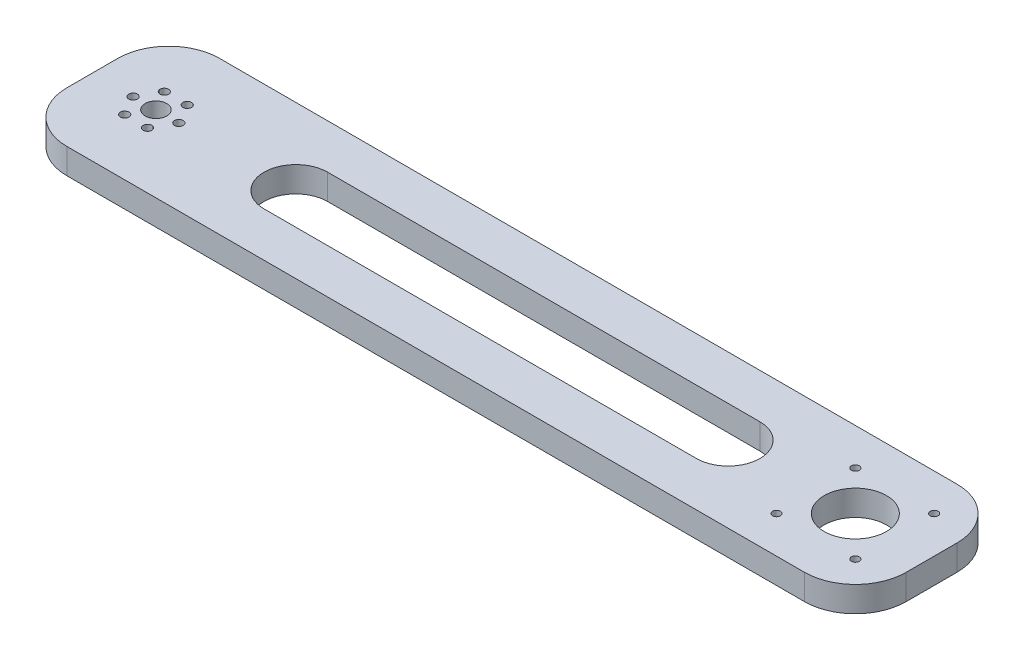
ISO-10303-21;
HEADER;
FILE_DESCRIPTION(('STEP AP214'),'2;1');
FILE_NAME('part.step','',(''),(''),'','','');
FILE_SCHEMA(('AUTOMOTIVE_DESIGN { 1 0 10303 214 1 1 1 1 }'));
ENDSEC;
DATA;
#1=APPLICATION_CONTEXT('core data for automotive mechanical design processes');
#2=APPLICATION_PROTOCOL_DEFINITION('international standard','automotive_design',2000,#1);
#3=PRODUCT_CONTEXT('',#1,'mechanical');
#4=PRODUCT('Part','Part','',(#3));
#5=PRODUCT_RELATED_PRODUCT_CATEGORY('part','',(#4));
#6=PRODUCT_DEFINITION_FORMATION('','',#4);
#7=PRODUCT_DEFINITION_CONTEXT('part definition',#1,'design');
#8=PRODUCT_DEFINITION('design','',#6,#7);
#9=PRODUCT_DEFINITION_SHAPE('','',#8);
#10=(LENGTH_UNIT() NAMED_UNIT(*) SI_UNIT(.MILLI.,.METRE.));
#11=(NAMED_UNIT(*) PLANE_ANGLE_UNIT() SI_UNIT($,.RADIAN.));
#12=(NAMED_UNIT(*) SI_UNIT($,.STERADIAN.) SOLID_ANGLE_UNIT());
#13=UNCERTAINTY_MEASURE_WITH_UNIT(LENGTH_MEASURE(1.E-05),#10,'distance_accuracy_value','');
#14=(GEOMETRIC_REPRESENTATION_CONTEXT(3) GLOBAL_UNCERTAINTY_ASSIGNED_CONTEXT((#13)) GLOBAL_UNIT_ASSIGNED_CONTEXT((#10,
#11,#12)) REPRESENTATION_CONTEXT('',''));
#15=CARTESIAN_POINT('',(0.,0.,0.));
#16=DIRECTION('',(0.,0.,1.));
#17=DIRECTION('',(1.,0.,0.));
#18=AXIS2_PLACEMENT_3D('',#15,#16,#17);
#19=CARTESIAN_POINT('',(165.,10.,30.));
#20=DIRECTION('',(-1.,0.,0.));
#21=DIRECTION('',(0.,0.,1.));
#22=AXIS2_PLACEMENT_3D('',#19,#20,#21);
#23=PLANE('',#22);
#24=DIRECTION('',(0.,0.,-1.));
#25=VECTOR('',#24,1.);
#26=CARTESIAN_POINT('',(165.,10.,30.));
#27=LINE('',#26,#25);
#28=CARTESIAN_POINT('',(165.,10.,9.99999999999999));
#29=VERTEX_POINT('',#28);
#30=CARTESIAN_POINT('',(165.,10.,-10.));
#31=VERTEX_POINT('',#30);
#32=EDGE_CURVE('E234',#29,#31,#27,.T.);
#33=ORIENTED_EDGE('',*,*,#32,.F.);
#34=DIRECTION('',(0.,-1.,0.));
#35=VECTOR('',#34,1.);
#36=CARTESIAN_POINT('',(165.,10.,9.99999999999999));
#37=LINE('',#36,#35);
#38=CARTESIAN_POINT('',(165.,0.,9.99999999999999));
#39=VERTEX_POINT('',#38);
#40=EDGE_CURVE('E269',#29,#39,#37,.T.);
#41=ORIENTED_EDGE('',*,*,#40,.T.);
#42=DIRECTION('',(0.,0.,-1.));
#43=VECTOR('',#42,1.);
#44=CARTESIAN_POINT('',(165.,0.,30.));
#45=LINE('',#44,#43);
#46=CARTESIAN_POINT('',(165.,0.,-10.));
#47=VERTEX_POINT('',#46);
#48=EDGE_CURVE('E255',#39,#47,#45,.T.);
#49=ORIENTED_EDGE('',*,*,#48,.T.);
#50=DIRECTION('',(0.,-1.,0.));
#51=VECTOR('',#50,1.);
#52=CARTESIAN_POINT('',(165.,10.,-10.));
#53=LINE('',#52,#51);
#54=EDGE_CURVE('E252',#47,#31,#53,.F.);
#55=ORIENTED_EDGE('',*,*,#54,.T.);
#56=EDGE_LOOP('',(#33,#41,#49,#55));
#57=FACE_BOUND('',#56,.T.);
#58=ADVANCED_FACE('F50',(#57),#23,.F.);
#59=CARTESIAN_POINT('',(-165.,10.,-30.));
#60=DIRECTION('',(0.,0.,1.));
#61=DIRECTION('',(1.,0.,0.));
#62=AXIS2_PLACEMENT_3D('',#59,#60,#61);
#63=PLANE('',#62);
#64=DIRECTION('',(-1.,0.,0.));
#65=VECTOR('',#64,1.);
#66=CARTESIAN_POINT('',(-165.,10.,-30.));
#67=LINE('',#66,#65);
#68=CARTESIAN_POINT('',(145.,10.,-30.));
#69=VERTEX_POINT('',#68);
#70=CARTESIAN_POINT('',(-145.,10.,-30.));
#71=VERTEX_POINT('',#70);
#72=EDGE_CURVE('E238',#69,#71,#67,.T.);
#73=ORIENTED_EDGE('',*,*,#72,.F.);
#74=DIRECTION('',(0.,-1.,0.));
#75=VECTOR('',#74,1.);
#76=CARTESIAN_POINT('',(145.,10.,-30.));
#77=LINE('',#76,#75);
#78=CARTESIAN_POINT('',(145.,0.,-30.));
#79=VERTEX_POINT('',#78);
#80=EDGE_CURVE('E310',#69,#79,#77,.T.);
#81=ORIENTED_EDGE('',*,*,#80,.T.);
#82=DIRECTION('',(-1.,0.,0.));
#83=VECTOR('',#82,1.);
#84=CARTESIAN_POINT('',(-165.,0.,-30.));
#85=LINE('',#84,#83);
#86=CARTESIAN_POINT('',(-145.,0.,-30.));
#87=VERTEX_POINT('',#86);
#88=EDGE_CURVE('E257',#79,#87,#85,.T.);
#89=ORIENTED_EDGE('',*,*,#88,.T.);
#90=DIRECTION('',(0.,-1.,0.));
#91=VECTOR('',#90,1.);
#92=CARTESIAN_POINT('',(-145.,10.,-30.));
#93=LINE('',#92,#91);
#94=EDGE_CURVE('E302',#87,#71,#93,.F.);
#95=ORIENTED_EDGE('',*,*,#94,.T.);
#96=EDGE_LOOP('',(#73,#81,#89,#95));
#97=FACE_BOUND('',#96,.T.);
#98=ADVANCED_FACE('F346',(#97),#63,.F.);
#99=CARTESIAN_POINT('',(-165.,10.,30.));
#100=DIRECTION('',(1.,0.,0.));
#101=DIRECTION('',(0.,0.,-1.));
#102=AXIS2_PLACEMENT_3D('',#99,#100,#101);
#103=PLANE('',#102);
#104=DIRECTION('',(0.,0.,1.));
#105=VECTOR('',#104,1.);
#106=CARTESIAN_POINT('',(-165.,10.,30.));
#107=LINE('',#106,#105);
#108=CARTESIAN_POINT('',(-165.,10.,-10.));
#109=VERTEX_POINT('',#108);
#110=CARTESIAN_POINT('',(-165.,10.,9.99999999999999));
#111=VERTEX_POINT('',#110);
#112=EDGE_CURVE('E243',#109,#111,#107,.T.);
#113=ORIENTED_EDGE('',*,*,#112,.F.);
#114=DIRECTION('',(0.,-1.,0.));
#115=VECTOR('',#114,1.);
#116=CARTESIAN_POINT('',(-165.,10.,-10.));
#117=LINE('',#116,#115);
#118=CARTESIAN_POINT('',(-165.,0.,-10.));
#119=VERTEX_POINT('',#118);
#120=EDGE_CURVE('E11',#109,#119,#117,.T.);
#121=ORIENTED_EDGE('',*,*,#120,.T.);
#122=DIRECTION('',(0.,0.,1.));
#123=VECTOR('',#122,1.);
#124=CARTESIAN_POINT('',(-165.,0.,30.));
#125=LINE('',#124,#123);
#126=CARTESIAN_POINT('',(-165.,0.,9.99999999999999));
#127=VERTEX_POINT('',#126);
#128=EDGE_CURVE('E256',#119,#127,#125,.T.);
#129=ORIENTED_EDGE('',*,*,#128,.T.);
#130=DIRECTION('',(0.,-1.,0.));
#131=VECTOR('',#130,1.);
#132=CARTESIAN_POINT('',(-165.,10.,9.99999999999999));
#133=LINE('',#132,#131);
#134=EDGE_CURVE('E60',#127,#111,#133,.F.);
#135=ORIENTED_EDGE('',*,*,#134,.T.);
#136=EDGE_LOOP('',(#113,#121,#129,#135));
#137=FACE_BOUND('',#136,.T.);
#138=ADVANCED_FACE('F317',(#137),#103,.F.);
#139=CARTESIAN_POINT('',(-165.,10.,30.));
#140=DIRECTION('',(0.,0.,-1.));
#141=DIRECTION('',(-1.,0.,0.));
#142=AXIS2_PLACEMENT_3D('',#139,#140,#141);
#143=PLANE('',#142);
#144=DIRECTION('',(1.,0.,0.));
#145=VECTOR('',#144,1.);
#146=CARTESIAN_POINT('',(-165.,0.,30.));
#147=LINE('',#146,#145);
#148=CARTESIAN_POINT('',(-145.,0.,30.));
#149=VERTEX_POINT('',#148);
#150=CARTESIAN_POINT('',(145.,0.,30.));
#151=VERTEX_POINT('',#150);
#152=EDGE_CURVE('E237',#149,#151,#147,.T.);
#153=ORIENTED_EDGE('',*,*,#152,.T.);
#154=DIRECTION('',(0.,-1.,0.));
#155=VECTOR('',#154,1.);
#156=CARTESIAN_POINT('',(145.,10.,30.));
#157=LINE('',#156,#155);
#158=CARTESIAN_POINT('',(145.,10.,30.));
#159=VERTEX_POINT('',#158);
#160=EDGE_CURVE('E289',#151,#159,#157,.F.);
#161=ORIENTED_EDGE('',*,*,#160,.T.);
#162=DIRECTION('',(1.,0.,0.));
#163=VECTOR('',#162,1.);
#164=CARTESIAN_POINT('',(-165.,10.,30.));
#165=LINE('',#164,#163);
#166=CARTESIAN_POINT('',(-145.,10.,30.));
#167=VERTEX_POINT('',#166);
#168=EDGE_CURVE('E250',#167,#159,#165,.T.);
#169=ORIENTED_EDGE('',*,*,#168,.F.);
#170=DIRECTION('',(0.,-1.,0.));
#171=VECTOR('',#170,1.);
#172=CARTESIAN_POINT('',(-145.,10.,30.));
#173=LINE('',#172,#171);
#174=EDGE_CURVE('E284',#167,#149,#173,.T.);
#175=ORIENTED_EDGE('',*,*,#174,.T.);
#176=EDGE_LOOP('',(#153,#161,#169,#175));
#177=FACE_BOUND('',#176,.T.);
#178=ADVANCED_FACE('F330',(#177),#143,.F.);
#179=CARTESIAN_POINT('',(0.,10.,0.));
#180=DIRECTION('',(0.,-1.,0.));
#181=DIRECTION('',(0.,0.,-1.));
#182=AXIS2_PLACEMENT_3D('',#179,#180,#181);
#183=PLANE('',#182);
#184=CARTESIAN_POINT('',(-144.5,10.,7.7942286340599));
#185=DIRECTION('',(0.,-1.,0.));
#186=DIRECTION('',(-0.866025403784433,0.,-0.50000000000001));
#187=AXIS2_PLACEMENT_3D('',#184,#185,#186);
#188=CIRCLE('',#187,1.70000000000001);
#189=CARTESIAN_POINT('',(-145.972243186434,10.,6.94422863405988));
#190=VERTEX_POINT('',#189);
#191=EDGE_CURVE('E647',#190,#190,#188,.T.);
#192=ORIENTED_EDGE('',*,*,#191,.T.);
#193=EDGE_LOOP('',(#192));
#194=FACE_BOUND('',#193,.T.);
#195=CARTESIAN_POINT('',(-135.5,10.,7.79422863405999));
#196=DIRECTION('',(0.,-1.,0.));
#197=DIRECTION('',(-0.866025403784443,0.,0.499999999999992));
#198=AXIS2_PLACEMENT_3D('',#195,#196,#197);
#199=CIRCLE('',#198,1.70000000000001);
#200=CARTESIAN_POINT('',(-136.972243186434,10.,8.64422863405998));
#201=VERTEX_POINT('',#200);
#202=EDGE_CURVE('E653',#201,#201,#199,.T.);
#203=ORIENTED_EDGE('',*,*,#202,.T.);
#204=EDGE_LOOP('',(#203));
#205=FACE_BOUND('',#204,.T.);
#206=CARTESIAN_POINT('',(-131.,10.,0.));
#207=DIRECTION('',(0.,-1.,0.));
#208=DIRECTION('',(0.,0.,1.));
#209=AXIS2_PLACEMENT_3D('',#206,#207,#208);
#210=CIRCLE('',#209,1.70000000000001);
#211=CARTESIAN_POINT('',(-131.,10.,1.70000000000001));
#212=VERTEX_POINT('',#211);
#213=EDGE_CURVE('E633',#212,#212,#210,.T.);
#214=ORIENTED_EDGE('',*,*,#213,.T.);
#215=EDGE_LOOP('',(#214));
#216=FACE_BOUND('',#215,.T.);
#217=CARTESIAN_POINT('',(-135.5,10.,-7.79422863405994));
#218=DIRECTION('',(0.,-1.,0.));
#219=DIRECTION('',(0.866025403784436,0.,0.500000000000004));
#220=AXIS2_PLACEMENT_3D('',#217,#218,#219);
#221=CIRCLE('',#220,1.70000000000001);
#222=CARTESIAN_POINT('',(-134.027756813566,10.,-6.94422863405993));
#223=VERTEX_POINT('',#222);
#224=EDGE_CURVE('E637',#223,#223,#221,.T.);
#225=ORIENTED_EDGE('',*,*,#224,.T.);
#226=EDGE_LOOP('',(#225));
#227=FACE_BOUND('',#226,.T.);
#228=CARTESIAN_POINT('',(-144.5,10.,-7.79422863405997));
#229=DIRECTION('',(0.,-1.,0.));
#230=DIRECTION('',(0.86602540378444,0.,-0.499999999999998));
#231=AXIS2_PLACEMENT_3D('',#228,#229,#230);
#232=CIRCLE('',#231,1.70000000000001);
#233=CARTESIAN_POINT('',(-143.027756813566,10.,-8.64422863405997));
#234=VERTEX_POINT('',#233);
#235=EDGE_CURVE('E644',#234,#234,#232,.T.);
#236=ORIENTED_EDGE('',*,*,#235,.T.);
#237=EDGE_LOOP('',(#236));
#238=FACE_BOUND('',#237,.T.);
#239=CARTESIAN_POINT('',(-149.,10.,0.));
#240=DIRECTION('',(0.,-1.,0.));
#241=DIRECTION('',(0.,0.,-1.));
#242=AXIS2_PLACEMENT_3D('',#239,#240,#241);
#243=CIRCLE('',#242,1.70000000000001);
#244=CARTESIAN_POINT('',(-149.,10.,-1.70000000000001));
#245=VERTEX_POINT('',#244);
#246=EDGE_CURVE('E176',#245,#245,#243,.T.);
#247=ORIENTED_EDGE('',*,*,#246,.T.);
#248=EDGE_LOOP('',(#247));
#249=FACE_BOUND('',#248,.T.);
#250=DIRECTION('',(-1.,0.,0.));
#251=VECTOR('',#250,1.);
#252=CARTESIAN_POINT('',(-85.,10.,12.5));
#253=LINE('',#252,#251);
#254=CARTESIAN_POINT('',(85.,10.,12.5));
#255=VERTEX_POINT('',#254);
#256=CARTESIAN_POINT('',(-85.,10.,12.5));
#257=VERTEX_POINT('',#256);
#258=EDGE_CURVE('E150',#255,#257,#253,.T.);
#259=ORIENTED_EDGE('',*,*,#258,.T.);
#260=CARTESIAN_POINT('',(-85.,10.,0.));
#261=DIRECTION('',(0.,-1.,0.));
#262=DIRECTION('',(0.,0.,-1.));
#263=AXIS2_PLACEMENT_3D('',#260,#261,#262);
#264=CIRCLE('',#263,12.5);
#265=CARTESIAN_POINT('',(-85.,10.,-12.5));
#266=VERTEX_POINT('',#265);
#267=EDGE_CURVE('E137',#257,#266,#264,.T.);
#268=ORIENTED_EDGE('',*,*,#267,.T.);
#269=DIRECTION('',(1.,0.,0.));
#270=VECTOR('',#269,1.);
#271=CARTESIAN_POINT('',(-85.,10.,-12.5));
#272=LINE('',#271,#270);
#273=CARTESIAN_POINT('',(85.,10.,-12.5));
#274=VERTEX_POINT('',#273);
#275=EDGE_CURVE('E146',#266,#274,#272,.T.);
#276=ORIENTED_EDGE('',*,*,#275,.T.);
#277=CARTESIAN_POINT('',(85.,10.,0.));
#278=DIRECTION('',(0.,-1.,0.));
#279=DIRECTION('',(0.,0.,-1.));
#280=AXIS2_PLACEMENT_3D('',#277,#278,#279);
#281=CIRCLE('',#280,12.5);
#282=EDGE_CURVE('E64',#274,#255,#281,.T.);
#283=ORIENTED_EDGE('',*,*,#282,.T.);
#284=EDGE_LOOP('',(#259,#268,#276,#283));
#285=FACE_BOUND('',#284,.T.);
#286=CARTESIAN_POINT('',(-140.,10.,0.));
#287=DIRECTION('',(0.,-1.,0.));
#288=DIRECTION('',(0.,0.,-1.));
#289=AXIS2_PLACEMENT_3D('',#286,#287,#288);
#290=CIRCLE('',#289,4.25000000000001);
#291=CARTESIAN_POINT('',(-140.,10.,-4.25000000000001));
#292=VERTEX_POINT('',#291);
#293=EDGE_CURVE('E192',#292,#292,#290,.T.);
#294=ORIENTED_EDGE('',*,*,#293,.T.);
#295=EDGE_LOOP('',(#294));
#296=FACE_BOUND('',#295,.T.);
#297=CARTESIAN_POINT('',(119.5,10.,-15.5));
#298=DIRECTION('',(0.,-1.,0.));
#299=DIRECTION('',(0.,0.,-1.));
#300=AXIS2_PLACEMENT_3D('',#297,#298,#299);
#301=CIRCLE('',#300,1.54999999999982);
#302=CARTESIAN_POINT('',(119.5,10.,-17.0499999999999));
#303=VERTEX_POINT('',#302);
#304=EDGE_CURVE('E191',#303,#303,#301,.T.);
#305=ORIENTED_EDGE('',*,*,#304,.T.);
#306=EDGE_LOOP('',(#305));
#307=FACE_BOUND('',#306,.T.);
#308=CARTESIAN_POINT('',(150.5,10.,-15.5));
#309=DIRECTION('',(0.,-1.,0.));
#310=DIRECTION('',(0.,0.,-1.));
#311=AXIS2_PLACEMENT_3D('',#308,#309,#310);
#312=CIRCLE('',#311,1.54999999999999);
#313=CARTESIAN_POINT('',(150.5,10.,-17.05));
#314=VERTEX_POINT('',#313);
#315=EDGE_CURVE('E215',#314,#314,#312,.T.);
#316=ORIENTED_EDGE('',*,*,#315,.T.);
#317=EDGE_LOOP('',(#316));
#318=FACE_BOUND('',#317,.T.);
#319=CARTESIAN_POINT('',(150.5,10.,15.5));
#320=DIRECTION('',(0.,-1.,0.));
#321=DIRECTION('',(0.,0.,-1.));
#322=AXIS2_PLACEMENT_3D('',#319,#320,#321);
#323=CIRCLE('',#322,1.54999999999999);
#324=CARTESIAN_POINT('',(150.5,10.,13.95));
#325=VERTEX_POINT('',#324);
#326=EDGE_CURVE('E204',#325,#325,#323,.T.);
#327=ORIENTED_EDGE('',*,*,#326,.T.);
#328=EDGE_LOOP('',(#327));
#329=FACE_BOUND('',#328,.T.);
#330=CARTESIAN_POINT('',(119.5,10.,15.5));
#331=DIRECTION('',(0.,-1.,0.));
#332=DIRECTION('',(0.,0.,-1.));
#333=AXIS2_PLACEMENT_3D('',#330,#331,#332);
#334=CIRCLE('',#333,1.54999999999976);
#335=CARTESIAN_POINT('',(119.5,10.,13.9500000000002));
#336=VERTEX_POINT('',#335);
#337=EDGE_CURVE('E221',#336,#336,#334,.T.);
#338=ORIENTED_EDGE('',*,*,#337,.T.);
#339=EDGE_LOOP('',(#338));
#340=FACE_BOUND('',#339,.T.);
#341=CARTESIAN_POINT('',(135.,10.,0.));
#342=DIRECTION('',(0.,1.,0.));
#343=DIRECTION('',(0.,0.,1.));
#344=AXIS2_PLACEMENT_3D('',#341,#342,#343);
#345=CIRCLE('',#344,12.25);
#346=CARTESIAN_POINT('',(135.,10.,12.25));
#347=VERTEX_POINT('',#346);
#348=EDGE_CURVE('E227',#347,#347,#345,.T.);
#349=ORIENTED_EDGE('',*,*,#348,.F.);
#350=EDGE_LOOP('',(#349));
#351=FACE_BOUND('',#350,.T.);
#352=ORIENTED_EDGE('',*,*,#168,.T.);
#353=CARTESIAN_POINT('',(145.,10.,9.99999999999999));
#354=DIRECTION('',(0.,-1.,0.));
#355=DIRECTION('',(0.,0.,-1.));
#356=AXIS2_PLACEMENT_3D('',#353,#354,#355);
#357=CIRCLE('',#356,20.);
#358=EDGE_CURVE('E301',#159,#29,#357,.F.);
#359=ORIENTED_EDGE('',*,*,#358,.T.);
#360=ORIENTED_EDGE('',*,*,#32,.T.);
#361=CARTESIAN_POINT('',(145.,10.,-10.));
#362=DIRECTION('',(0.,-1.,0.));
#363=DIRECTION('',(0.,0.,-1.));
#364=AXIS2_PLACEMENT_3D('',#361,#362,#363);
#365=CIRCLE('',#364,20.);
#366=EDGE_CURVE('E296',#31,#69,#365,.F.);
#367=ORIENTED_EDGE('',*,*,#366,.T.);
#368=ORIENTED_EDGE('',*,*,#72,.T.);
#369=CARTESIAN_POINT('',(-145.,10.,-10.));
#370=DIRECTION('',(0.,-1.,0.));
#371=DIRECTION('',(0.,0.,-1.));
#372=AXIS2_PLACEMENT_3D('',#369,#370,#371);
#373=CIRCLE('',#372,20.);
#374=EDGE_CURVE('E294',#71,#109,#373,.F.);
#375=ORIENTED_EDGE('',*,*,#374,.T.);
#376=ORIENTED_EDGE('',*,*,#112,.T.);
#377=CARTESIAN_POINT('',(-145.,10.,9.99999999999999));
#378=DIRECTION('',(0.,-1.,0.));
#379=DIRECTION('',(0.,0.,-1.));
#380=AXIS2_PLACEMENT_3D('',#377,#378,#379);
#381=CIRCLE('',#380,20.);
#382=EDGE_CURVE('E292',#111,#167,#381,.F.);
#383=ORIENTED_EDGE('',*,*,#382,.T.);
#384=EDGE_LOOP('',(#352,#359,#360,#367,#368,#375,#376,#383));
#385=FACE_BOUND('',#384,.T.);
#386=ADVANCED_FACE('F154',(#194,#205,#216,#227,#238,#249,#285,#296,#307,#318,#329,#340,#351,
#385),#183,.F.);
#387=CARTESIAN_POINT('',(0.,0.,0.));
#388=DIRECTION('',(0.,-1.,0.));
#389=DIRECTION('',(0.,0.,-1.));
#390=AXIS2_PLACEMENT_3D('',#387,#388,#389);
#391=PLANE('',#390);
#392=CARTESIAN_POINT('',(-144.5,0.,7.7942286340599));
#393=DIRECTION('',(0.,-1.,0.));
#394=DIRECTION('',(-0.866025403784433,0.,-0.50000000000001));
#395=AXIS2_PLACEMENT_3D('',#392,#393,#394);
#396=CIRCLE('',#395,1.70000000000001);
#397=CARTESIAN_POINT('',(-145.972243186434,0.,6.94422863405988));
#398=VERTEX_POINT('',#397);
#399=EDGE_CURVE('E649',#398,#398,#396,.T.);
#400=ORIENTED_EDGE('',*,*,#399,.F.);
#401=EDGE_LOOP('',(#400));
#402=FACE_BOUND('',#401,.T.);
#403=CARTESIAN_POINT('',(-135.5,0.,7.79422863405999));
#404=DIRECTION('',(0.,-1.,0.));
#405=DIRECTION('',(-0.866025403784443,0.,0.499999999999992));
#406=AXIS2_PLACEMENT_3D('',#403,#404,#405);
#407=CIRCLE('',#406,1.70000000000001);
#408=CARTESIAN_POINT('',(-136.972243186434,0.,8.64422863405998));
#409=VERTEX_POINT('',#408);
#410=EDGE_CURVE('E648',#409,#409,#407,.T.);
#411=ORIENTED_EDGE('',*,*,#410,.F.);
#412=EDGE_LOOP('',(#411));
#413=FACE_BOUND('',#412,.T.);
#414=CARTESIAN_POINT('',(-131.,0.,0.));
#415=DIRECTION('',(0.,-1.,0.));
#416=DIRECTION('',(0.,0.,1.));
#417=AXIS2_PLACEMENT_3D('',#414,#415,#416);
#418=CIRCLE('',#417,1.70000000000001);
#419=CARTESIAN_POINT('',(-131.,0.,1.70000000000001));
#420=VERTEX_POINT('',#419);
#421=EDGE_CURVE('E655',#420,#420,#418,.T.);
#422=ORIENTED_EDGE('',*,*,#421,.F.);
#423=EDGE_LOOP('',(#422));
#424=FACE_BOUND('',#423,.T.);
#425=CARTESIAN_POINT('',(-135.5,0.,-7.79422863405994));
#426=DIRECTION('',(0.,-1.,0.));
#427=DIRECTION('',(0.866025403784436,0.,0.500000000000004));
#428=AXIS2_PLACEMENT_3D('',#425,#426,#427);
#429=CIRCLE('',#428,1.70000000000001);
#430=CARTESIAN_POINT('',(-134.027756813566,0.,-6.94422863405993));
#431=VERTEX_POINT('',#430);
#432=EDGE_CURVE('E636',#431,#431,#429,.T.);
#433=ORIENTED_EDGE('',*,*,#432,.F.);
#434=EDGE_LOOP('',(#433));
#435=FACE_BOUND('',#434,.T.);
#436=CARTESIAN_POINT('',(-144.5,0.,-7.79422863405997));
#437=DIRECTION('',(0.,-1.,0.));
#438=DIRECTION('',(0.86602540378444,0.,-0.499999999999998));
#439=AXIS2_PLACEMENT_3D('',#436,#437,#438);
#440=CIRCLE('',#439,1.70000000000001);
#441=CARTESIAN_POINT('',(-143.027756813566,0.,-8.64422863405997));
#442=VERTEX_POINT('',#441);
#443=EDGE_CURVE('E642',#442,#442,#440,.T.);
#444=ORIENTED_EDGE('',*,*,#443,.F.);
#445=EDGE_LOOP('',(#444));
#446=FACE_BOUND('',#445,.T.);
#447=CARTESIAN_POINT('',(-149.,0.,0.));
#448=DIRECTION('',(0.,-1.,0.));
#449=DIRECTION('',(0.,0.,-1.));
#450=AXIS2_PLACEMENT_3D('',#447,#448,#449);
#451=CIRCLE('',#450,1.70000000000001);
#452=CARTESIAN_POINT('',(-149.,0.,-1.70000000000001));
#453=VERTEX_POINT('',#452);
#454=EDGE_CURVE('E170',#453,#453,#451,.T.);
#455=ORIENTED_EDGE('',*,*,#454,.F.);
#456=EDGE_LOOP('',(#455));
#457=FACE_BOUND('',#456,.T.);
#458=CARTESIAN_POINT('',(-85.,0.,0.));
#459=DIRECTION('',(0.,-1.,0.));
#460=DIRECTION('',(0.,0.,-1.));
#461=AXIS2_PLACEMENT_3D('',#458,#459,#460);
#462=CIRCLE('',#461,12.5);
#463=CARTESIAN_POINT('',(-85.,0.,12.5));
#464=VERTEX_POINT('',#463);
#465=CARTESIAN_POINT('',(-85.,0.,-12.5));
#466=VERTEX_POINT('',#465);
#467=EDGE_CURVE('E75',#464,#466,#462,.T.);
#468=ORIENTED_EDGE('',*,*,#467,.F.);
#469=DIRECTION('',(-1.,0.,0.));
#470=VECTOR('',#469,1.);
#471=CARTESIAN_POINT('',(-85.,0.,12.5));
#472=LINE('',#471,#470);
#473=CARTESIAN_POINT('',(85.,0.,12.5));
#474=VERTEX_POINT('',#473);
#475=EDGE_CURVE('E159',#474,#464,#472,.T.);
#476=ORIENTED_EDGE('',*,*,#475,.F.);
#477=CARTESIAN_POINT('',(85.,0.,0.));
#478=DIRECTION('',(0.,-1.,0.));
#479=DIRECTION('',(0.,0.,-1.));
#480=AXIS2_PLACEMENT_3D('',#477,#478,#479);
#481=CIRCLE('',#480,12.5);
#482=CARTESIAN_POINT('',(85.,0.,-12.5));
#483=VERTEX_POINT('',#482);
#484=EDGE_CURVE('E165',#483,#474,#481,.T.);
#485=ORIENTED_EDGE('',*,*,#484,.F.);
#486=DIRECTION('',(1.,0.,0.));
#487=VECTOR('',#486,1.);
#488=CARTESIAN_POINT('',(-85.,0.,-12.5));
#489=LINE('',#488,#487);
#490=EDGE_CURVE('E174',#466,#483,#489,.T.);
#491=ORIENTED_EDGE('',*,*,#490,.F.);
#492=EDGE_LOOP('',(#468,#476,#485,#491));
#493=FACE_BOUND('',#492,.T.);
#494=CARTESIAN_POINT('',(-140.,0.,0.));
#495=DIRECTION('',(0.,-1.,0.));
#496=DIRECTION('',(0.,0.,-1.));
#497=AXIS2_PLACEMENT_3D('',#494,#495,#496);
#498=CIRCLE('',#497,4.25000000000001);
#499=CARTESIAN_POINT('',(-140.,0.,-4.25000000000001));
#500=VERTEX_POINT('',#499);
#501=EDGE_CURVE('E184',#500,#500,#498,.T.);
#502=ORIENTED_EDGE('',*,*,#501,.F.);
#503=EDGE_LOOP('',(#502));
#504=FACE_BOUND('',#503,.T.);
#505=CARTESIAN_POINT('',(119.5,0.,-15.5));
#506=DIRECTION('',(0.,-1.,0.));
#507=DIRECTION('',(0.,0.,-1.));
#508=AXIS2_PLACEMENT_3D('',#505,#506,#507);
#509=CIRCLE('',#508,1.54999999999982);
#510=CARTESIAN_POINT('',(119.5,0.,-17.0499999999999));
#511=VERTEX_POINT('',#510);
#512=EDGE_CURVE('E216',#511,#511,#509,.T.);
#513=ORIENTED_EDGE('',*,*,#512,.F.);
#514=EDGE_LOOP('',(#513));
#515=FACE_BOUND('',#514,.T.);
#516=CARTESIAN_POINT('',(150.5,0.,-15.5));
#517=DIRECTION('',(0.,-1.,0.));
#518=DIRECTION('',(0.,0.,-1.));
#519=AXIS2_PLACEMENT_3D('',#516,#517,#518);
#520=CIRCLE('',#519,1.54999999999999);
#521=CARTESIAN_POINT('',(150.5,0.,-17.05));
#522=VERTEX_POINT('',#521);
#523=EDGE_CURVE('E206',#522,#522,#520,.T.);
#524=ORIENTED_EDGE('',*,*,#523,.F.);
#525=EDGE_LOOP('',(#524));
#526=FACE_BOUND('',#525,.T.);
#527=CARTESIAN_POINT('',(150.5,0.,15.5));
#528=DIRECTION('',(0.,-1.,0.));
#529=DIRECTION('',(0.,0.,-1.));
#530=AXIS2_PLACEMENT_3D('',#527,#528,#529);
#531=CIRCLE('',#530,1.54999999999999);
#532=CARTESIAN_POINT('',(150.5,0.,13.95));
#533=VERTEX_POINT('',#532);
#534=EDGE_CURVE('E198',#533,#533,#531,.T.);
#535=ORIENTED_EDGE('',*,*,#534,.F.);
#536=EDGE_LOOP('',(#535));
#537=FACE_BOUND('',#536,.T.);
#538=CARTESIAN_POINT('',(119.5,0.,15.5));
#539=DIRECTION('',(0.,-1.,0.));
#540=DIRECTION('',(0.,0.,-1.));
#541=AXIS2_PLACEMENT_3D('',#538,#539,#540);
#542=CIRCLE('',#541,1.54999999999976);
#543=CARTESIAN_POINT('',(119.5,0.,13.9500000000002));
#544=VERTEX_POINT('',#543);
#545=EDGE_CURVE('E201',#544,#544,#542,.T.);
#546=ORIENTED_EDGE('',*,*,#545,.F.);
#547=EDGE_LOOP('',(#546));
#548=FACE_BOUND('',#547,.T.);
#549=CARTESIAN_POINT('',(135.,0.,0.));
#550=DIRECTION('',(0.,-1.,0.));
#551=DIRECTION('',(0.,0.,-1.));
#552=AXIS2_PLACEMENT_3D('',#549,#550,#551);
#553=CIRCLE('',#552,12.25);
#554=CARTESIAN_POINT('',(135.,0.,-12.25));
#555=VERTEX_POINT('',#554);
#556=EDGE_CURVE('E51',#555,#555,#553,.T.);
#557=ORIENTED_EDGE('',*,*,#556,.F.);
#558=EDGE_LOOP('',(#557));
#559=FACE_BOUND('',#558,.T.);
#560=ORIENTED_EDGE('',*,*,#48,.F.);
#561=CARTESIAN_POINT('',(145.,0.,9.99999999999999));
#562=DIRECTION('',(0.,-1.,0.));
#563=DIRECTION('',(0.,0.,-1.));
#564=AXIS2_PLACEMENT_3D('',#561,#562,#563);
#565=CIRCLE('',#564,20.);
#566=EDGE_CURVE('E285',#39,#151,#565,.T.);
#567=ORIENTED_EDGE('',*,*,#566,.T.);
#568=ORIENTED_EDGE('',*,*,#152,.F.);
#569=CARTESIAN_POINT('',(-145.,0.,9.99999999999999));
#570=DIRECTION('',(0.,-1.,0.));
#571=DIRECTION('',(0.,0.,-1.));
#572=AXIS2_PLACEMENT_3D('',#569,#570,#571);
#573=CIRCLE('',#572,20.);
#574=EDGE_CURVE('E271',#149,#127,#573,.T.);
#575=ORIENTED_EDGE('',*,*,#574,.T.);
#576=ORIENTED_EDGE('',*,*,#128,.F.);
#577=CARTESIAN_POINT('',(-145.,0.,-10.));
#578=DIRECTION('',(0.,-1.,0.));
#579=DIRECTION('',(0.,0.,-1.));
#580=AXIS2_PLACEMENT_3D('',#577,#578,#579);
#581=CIRCLE('',#580,20.);
#582=EDGE_CURVE('E277',#119,#87,#581,.T.);
#583=ORIENTED_EDGE('',*,*,#582,.T.);
#584=ORIENTED_EDGE('',*,*,#88,.F.);
#585=CARTESIAN_POINT('',(145.,0.,-10.));
#586=DIRECTION('',(0.,-1.,0.));
#587=DIRECTION('',(0.,0.,-1.));
#588=AXIS2_PLACEMENT_3D('',#585,#586,#587);
#589=CIRCLE('',#588,20.);
#590=EDGE_CURVE('E279',#79,#47,#589,.T.);
#591=ORIENTED_EDGE('',*,*,#590,.T.);
#592=EDGE_LOOP('',(#560,#567,#568,#575,#576,#583,#584,#591));
#593=FACE_BOUND('',#592,.T.);
#594=ADVANCED_FACE('F333',(#402,#413,#424,#435,#446,#457,#493,#504,#515,#526,#537,#548,#559,
#593),#391,.T.);
#595=CARTESIAN_POINT('',(145.,10.,9.99999999999999));
#596=DIRECTION('',(0.,-1.,0.));
#597=DIRECTION('',(0.,0.,-1.));
#598=AXIS2_PLACEMENT_3D('',#595,#596,#597);
#599=CYLINDRICAL_SURFACE('',#598,20.);
#600=ORIENTED_EDGE('',*,*,#358,.F.);
#601=ORIENTED_EDGE('',*,*,#160,.F.);
#602=ORIENTED_EDGE('',*,*,#566,.F.);
#603=ORIENTED_EDGE('',*,*,#40,.F.);
#604=EDGE_LOOP('',(#600,#601,#602,#603));
#605=FACE_BOUND('',#604,.T.);
#606=ADVANCED_FACE('F332',(#605),#599,.T.);
#607=CARTESIAN_POINT('',(145.,10.,-10.));
#608=DIRECTION('',(0.,-1.,0.));
#609=DIRECTION('',(0.,0.,-1.));
#610=AXIS2_PLACEMENT_3D('',#607,#608,#609);
#611=CYLINDRICAL_SURFACE('',#610,20.);
#612=ORIENTED_EDGE('',*,*,#366,.F.);
#613=ORIENTED_EDGE('',*,*,#54,.F.);
#614=ORIENTED_EDGE('',*,*,#590,.F.);
#615=ORIENTED_EDGE('',*,*,#80,.F.);
#616=EDGE_LOOP('',(#612,#613,#614,#615));
#617=FACE_BOUND('',#616,.T.);
#618=ADVANCED_FACE('F343',(#617),#611,.T.);
#619=CARTESIAN_POINT('',(-145.,10.,-10.));
#620=DIRECTION('',(0.,-1.,0.));
#621=DIRECTION('',(0.,0.,-1.));
#622=AXIS2_PLACEMENT_3D('',#619,#620,#621);
#623=CYLINDRICAL_SURFACE('',#622,20.);
#624=ORIENTED_EDGE('',*,*,#374,.F.);
#625=ORIENTED_EDGE('',*,*,#94,.F.);
#626=ORIENTED_EDGE('',*,*,#582,.F.);
#627=ORIENTED_EDGE('',*,*,#120,.F.);
#628=EDGE_LOOP('',(#624,#625,#626,#627));
#629=FACE_BOUND('',#628,.T.);
#630=ADVANCED_FACE('F348',(#629),#623,.T.);
#631=CARTESIAN_POINT('',(-145.,10.,9.99999999999999));
#632=DIRECTION('',(0.,-1.,0.));
#633=DIRECTION('',(0.,0.,-1.));
#634=AXIS2_PLACEMENT_3D('',#631,#632,#633);
#635=CYLINDRICAL_SURFACE('',#634,20.);
#636=ORIENTED_EDGE('',*,*,#382,.F.);
#637=ORIENTED_EDGE('',*,*,#134,.F.);
#638=ORIENTED_EDGE('',*,*,#574,.F.);
#639=ORIENTED_EDGE('',*,*,#174,.F.);
#640=EDGE_LOOP('',(#636,#637,#638,#639));
#641=FACE_BOUND('',#640,.T.);
#642=ADVANCED_FACE('F47',(#641),#635,.T.);
#643=CARTESIAN_POINT('',(135.,-2.,0.));
#644=DIRECTION('',(0.,1.,0.));
#645=DIRECTION('',(0.,0.,1.));
#646=AXIS2_PLACEMENT_3D('',#643,#644,#645);
#647=CYLINDRICAL_SURFACE('',#646,12.25);
#648=ORIENTED_EDGE('',*,*,#556,.T.);
#649=EDGE_LOOP('',(#648));
#650=FACE_BOUND('',#649,.T.);
#651=ORIENTED_EDGE('',*,*,#348,.T.);
#652=EDGE_LOOP('',(#651));
#653=FACE_BOUND('',#652,.T.);
#654=ADVANCED_FACE('F354',(#650,#653),#647,.F.);
#655=CARTESIAN_POINT('',(119.5,10.,15.5));
#656=DIRECTION('',(0.,-1.,0.));
#657=DIRECTION('',(0.,0.,-1.));
#658=AXIS2_PLACEMENT_3D('',#655,#656,#657);
#659=CYLINDRICAL_SURFACE('',#658,1.54999999999976);
#660=ORIENTED_EDGE('',*,*,#337,.F.);
#661=EDGE_LOOP('',(#660));
#662=FACE_BOUND('',#661,.T.);
#663=ORIENTED_EDGE('',*,*,#545,.T.);
#664=EDGE_LOOP('',(#663));
#665=FACE_BOUND('',#664,.T.);
#666=ADVANCED_FACE('F511',(#662,#665),#659,.F.);
#667=CARTESIAN_POINT('',(150.5,10.,15.5));
#668=DIRECTION('',(0.,-1.,0.));
#669=DIRECTION('',(0.,0.,-1.));
#670=AXIS2_PLACEMENT_3D('',#667,#668,#669);
#671=CYLINDRICAL_SURFACE('',#670,1.54999999999999);
#672=ORIENTED_EDGE('',*,*,#326,.F.);
#673=EDGE_LOOP('',(#672));
#674=FACE_BOUND('',#673,.T.);
#675=ORIENTED_EDGE('',*,*,#534,.T.);
#676=EDGE_LOOP('',(#675));
#677=FACE_BOUND('',#676,.T.);
#678=ADVANCED_FACE('F510',(#674,#677),#671,.F.);
#679=CARTESIAN_POINT('',(150.5,10.,-15.5));
#680=DIRECTION('',(0.,-1.,0.));
#681=DIRECTION('',(0.,0.,-1.));
#682=AXIS2_PLACEMENT_3D('',#679,#680,#681);
#683=CYLINDRICAL_SURFACE('',#682,1.54999999999999);
#684=ORIENTED_EDGE('',*,*,#315,.F.);
#685=EDGE_LOOP('',(#684));
#686=FACE_BOUND('',#685,.T.);
#687=ORIENTED_EDGE('',*,*,#523,.T.);
#688=EDGE_LOOP('',(#687));
#689=FACE_BOUND('',#688,.T.);
#690=ADVANCED_FACE('F499',(#686,#689),#683,.F.);
#691=CARTESIAN_POINT('',(119.5,10.,-15.5));
#692=DIRECTION('',(0.,-1.,0.));
#693=DIRECTION('',(0.,0.,-1.));
#694=AXIS2_PLACEMENT_3D('',#691,#692,#693);
#695=CYLINDRICAL_SURFACE('',#694,1.54999999999982);
#696=ORIENTED_EDGE('',*,*,#304,.F.);
#697=EDGE_LOOP('',(#696));
#698=FACE_BOUND('',#697,.T.);
#699=ORIENTED_EDGE('',*,*,#512,.T.);
#700=EDGE_LOOP('',(#699));
#701=FACE_BOUND('',#700,.T.);
#702=ADVANCED_FACE('F491',(#698,#701),#695,.F.);
#703=CARTESIAN_POINT('',(-140.,10.,0.));
#704=DIRECTION('',(0.,-1.,0.));
#705=DIRECTION('',(0.,0.,-1.));
#706=AXIS2_PLACEMENT_3D('',#703,#704,#705);
#707=CYLINDRICAL_SURFACE('',#706,4.25000000000001);
#708=ORIENTED_EDGE('',*,*,#293,.F.);
#709=EDGE_LOOP('',(#708));
#710=FACE_BOUND('',#709,.T.);
#711=ORIENTED_EDGE('',*,*,#501,.T.);
#712=EDGE_LOOP('',(#711));
#713=FACE_BOUND('',#712,.T.);
#714=ADVANCED_FACE('F487',(#710,#713),#707,.F.);
#715=CARTESIAN_POINT('',(-85.,10.,0.));
#716=DIRECTION('',(0.,-1.,0.));
#717=DIRECTION('',(0.,0.,-1.));
#718=AXIS2_PLACEMENT_3D('',#715,#716,#717);
#719=CYLINDRICAL_SURFACE('',#718,12.5);
#720=ORIENTED_EDGE('',*,*,#467,.T.);
#721=DIRECTION('',(0.,-1.,0.));
#722=VECTOR('',#721,1.);
#723=CARTESIAN_POINT('',(-85.,10.,-12.5));
#724=LINE('',#723,#722);
#725=EDGE_CURVE('E138',#266,#466,#724,.T.);
#726=ORIENTED_EDGE('',*,*,#725,.F.);
#727=ORIENTED_EDGE('',*,*,#267,.F.);
#728=DIRECTION('',(0.,-1.,0.));
#729=VECTOR('',#728,1.);
#730=CARTESIAN_POINT('',(-85.,10.,12.5));
#731=LINE('',#730,#729);
#732=EDGE_CURVE('E185',#257,#464,#731,.T.);
#733=ORIENTED_EDGE('',*,*,#732,.T.);
#734=EDGE_LOOP('',(#720,#726,#727,#733));
#735=FACE_BOUND('',#734,.T.);
#736=ADVANCED_FACE('F136',(#735),#719,.F.);
#737=CARTESIAN_POINT('',(-85.,10.,12.5));
#738=DIRECTION('',(0.,0.,1.));
#739=DIRECTION('',(1.,0.,0.));
#740=AXIS2_PLACEMENT_3D('',#737,#738,#739);
#741=PLANE('',#740);
#742=ORIENTED_EDGE('',*,*,#475,.T.);
#743=ORIENTED_EDGE('',*,*,#732,.F.);
#744=ORIENTED_EDGE('',*,*,#258,.F.);
#745=DIRECTION('',(0.,-1.,0.));
#746=VECTOR('',#745,1.);
#747=CARTESIAN_POINT('',(85.,10.,12.5));
#748=LINE('',#747,#746);
#749=EDGE_CURVE('E187',#255,#474,#748,.T.);
#750=ORIENTED_EDGE('',*,*,#749,.T.);
#751=EDGE_LOOP('',(#742,#743,#744,#750));
#752=FACE_BOUND('',#751,.T.);
#753=ADVANCED_FACE('F471',(#752),#741,.F.);
#754=CARTESIAN_POINT('',(85.,10.,0.));
#755=DIRECTION('',(0.,-1.,0.));
#756=DIRECTION('',(0.,0.,-1.));
#757=AXIS2_PLACEMENT_3D('',#754,#755,#756);
#758=CYLINDRICAL_SURFACE('',#757,12.5);
#759=ORIENTED_EDGE('',*,*,#484,.T.);
#760=ORIENTED_EDGE('',*,*,#749,.F.);
#761=ORIENTED_EDGE('',*,*,#282,.F.);
#762=DIRECTION('',(0.,-1.,0.));
#763=VECTOR('',#762,1.);
#764=CARTESIAN_POINT('',(85.,10.,-12.5));
#765=LINE('',#764,#763);
#766=EDGE_CURVE('E147',#274,#483,#765,.T.);
#767=ORIENTED_EDGE('',*,*,#766,.T.);
#768=EDGE_LOOP('',(#759,#760,#761,#767));
#769=FACE_BOUND('',#768,.T.);
#770=ADVANCED_FACE('F469',(#769),#758,.F.);
#771=CARTESIAN_POINT('',(-85.,10.,-12.5));
#772=DIRECTION('',(0.,0.,-1.));
#773=DIRECTION('',(-1.,0.,0.));
#774=AXIS2_PLACEMENT_3D('',#771,#772,#773);
#775=PLANE('',#774);
#776=ORIENTED_EDGE('',*,*,#490,.T.);
#777=ORIENTED_EDGE('',*,*,#766,.F.);
#778=ORIENTED_EDGE('',*,*,#275,.F.);
#779=ORIENTED_EDGE('',*,*,#725,.T.);
#780=EDGE_LOOP('',(#776,#777,#778,#779));
#781=FACE_BOUND('',#780,.T.);
#782=ADVANCED_FACE('F151',(#781),#775,.F.);
#783=CARTESIAN_POINT('',(-149.,10.,0.));
#784=DIRECTION('',(0.,-1.,0.));
#785=DIRECTION('',(0.,0.,-1.));
#786=AXIS2_PLACEMENT_3D('',#783,#784,#785);
#787=CYLINDRICAL_SURFACE('',#786,1.70000000000001);
#788=ORIENTED_EDGE('',*,*,#246,.F.);
#789=EDGE_LOOP('',(#788));
#790=FACE_BOUND('',#789,.T.);
#791=ORIENTED_EDGE('',*,*,#454,.T.);
#792=EDGE_LOOP('',(#791));
#793=FACE_BOUND('',#792,.T.);
#794=ADVANCED_FACE('F392',(#790,#793),#787,.F.);
#795=CARTESIAN_POINT('',(-144.5,10.,-7.79422863405997));
#796=DIRECTION('',(0.,-1.,0.));
#797=DIRECTION('',(0.,0.,-1.));
#798=AXIS2_PLACEMENT_3D('',#795,#796,#797);
#799=CYLINDRICAL_SURFACE('',#798,1.70000000000001);
#800=ORIENTED_EDGE('',*,*,#235,.F.);
#801=EDGE_LOOP('',(#800));
#802=FACE_BOUND('',#801,.T.);
#803=ORIENTED_EDGE('',*,*,#443,.T.);
#804=EDGE_LOOP('',(#803));
#805=FACE_BOUND('',#804,.T.);
#806=ADVANCED_FACE('F404',(#802,#805),#799,.F.);
#807=CARTESIAN_POINT('',(-135.5,10.,-7.79422863405994));
#808=DIRECTION('',(0.,-1.,0.));
#809=DIRECTION('',(0.,0.,-1.));
#810=AXIS2_PLACEMENT_3D('',#807,#808,#809);
#811=CYLINDRICAL_SURFACE('',#810,1.70000000000001);
#812=ORIENTED_EDGE('',*,*,#224,.F.);
#813=EDGE_LOOP('',(#812));
#814=FACE_BOUND('',#813,.T.);
#815=ORIENTED_EDGE('',*,*,#432,.T.);
#816=EDGE_LOOP('',(#815));
#817=FACE_BOUND('',#816,.T.);
#818=ADVANCED_FACE('F406',(#814,#817),#811,.F.);
#819=CARTESIAN_POINT('',(-131.,10.,0.));
#820=DIRECTION('',(0.,-1.,0.));
#821=DIRECTION('',(0.,0.,-1.));
#822=AXIS2_PLACEMENT_3D('',#819,#820,#821);
#823=CYLINDRICAL_SURFACE('',#822,1.70000000000001);
#824=ORIENTED_EDGE('',*,*,#213,.F.);
#825=EDGE_LOOP('',(#824));
#826=FACE_BOUND('',#825,.T.);
#827=ORIENTED_EDGE('',*,*,#421,.T.);
#828=EDGE_LOOP('',(#827));
#829=FACE_BOUND('',#828,.T.);
#830=ADVANCED_FACE('F422',(#826,#829),#823,.F.);
#831=CARTESIAN_POINT('',(-135.5,10.,7.79422863405999));
#832=DIRECTION('',(0.,-1.,0.));
#833=DIRECTION('',(0.,0.,-1.));
#834=AXIS2_PLACEMENT_3D('',#831,#832,#833);
#835=CYLINDRICAL_SURFACE('',#834,1.70000000000001);
#836=ORIENTED_EDGE('',*,*,#202,.F.);
#837=EDGE_LOOP('',(#836));
#838=FACE_BOUND('',#837,.T.);
#839=ORIENTED_EDGE('',*,*,#410,.T.);
#840=EDGE_LOOP('',(#839));
#841=FACE_BOUND('',#840,.T.);
#842=ADVANCED_FACE('F432',(#838,#841),#835,.F.);
#843=CARTESIAN_POINT('',(-144.5,10.,7.7942286340599));
#844=DIRECTION('',(0.,-1.,0.));
#845=DIRECTION('',(0.,0.,-1.));
#846=AXIS2_PLACEMENT_3D('',#843,#844,#845);
#847=CYLINDRICAL_SURFACE('',#846,1.70000000000001);
#848=ORIENTED_EDGE('',*,*,#191,.F.);
#849=EDGE_LOOP('',(#848));
#850=FACE_BOUND('',#849,.T.);
#851=ORIENTED_EDGE('',*,*,#399,.T.);
#852=EDGE_LOOP('',(#851));
#853=FACE_BOUND('',#852,.T.);
#854=ADVANCED_FACE('F447',(#850,#853),#847,.F.);
#855=CLOSED_SHELL('',(#58,#98,#138,#178,#386,#594,#606,#618,#630,#642,#654,#666,#678,#690,#702,
#714,#736,#753,#770,#782,#794,#806,#818,#830,#842,#854));
#856=MANIFOLD_SOLID_BREP('B2',#855);
#857=ADVANCED_BREP_SHAPE_REPRESENTATION('',(#18,#856),#14);
#858=SHAPE_DEFINITION_REPRESENTATION(#9,#857);
ENDSEC;
END-ISO-10303-21;
